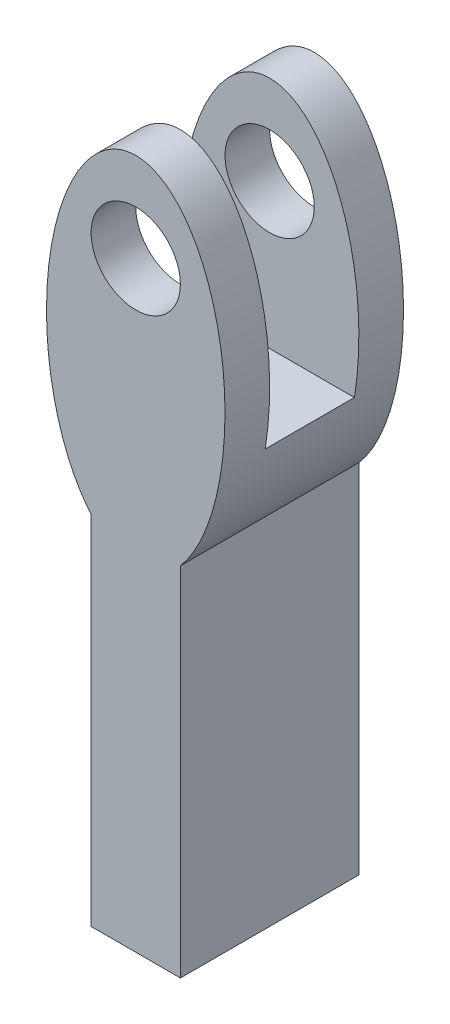
ISO-10303-21;
HEADER;
FILE_DESCRIPTION(('STEP AP214'),'2;1');
FILE_NAME('part.step','',(''),(''),'','','');
FILE_SCHEMA(('AUTOMOTIVE_DESIGN { 1 0 10303 214 1 1 1 1 }'));
ENDSEC;
DATA;
#1=APPLICATION_CONTEXT('core data for automotive mechanical design processes');
#2=APPLICATION_PROTOCOL_DEFINITION('international standard','automotive_design',2000,#1);
#3=PRODUCT_CONTEXT('',#1,'mechanical');
#4=PRODUCT('Part','Part','',(#3));
#5=PRODUCT_RELATED_PRODUCT_CATEGORY('part','',(#4));
#6=PRODUCT_DEFINITION_FORMATION('','',#4);
#7=PRODUCT_DEFINITION_CONTEXT('part definition',#1,'design');
#8=PRODUCT_DEFINITION('design','',#6,#7);
#9=PRODUCT_DEFINITION_SHAPE('','',#8);
#10=(LENGTH_UNIT() NAMED_UNIT(*) SI_UNIT(.MILLI.,.METRE.));
#11=(NAMED_UNIT(*) PLANE_ANGLE_UNIT() SI_UNIT($,.RADIAN.));
#12=(NAMED_UNIT(*) SI_UNIT($,.STERADIAN.) SOLID_ANGLE_UNIT());
#13=UNCERTAINTY_MEASURE_WITH_UNIT(LENGTH_MEASURE(1.E-05),#10,'distance_accuracy_value','');
#14=(GEOMETRIC_REPRESENTATION_CONTEXT(3) GLOBAL_UNCERTAINTY_ASSIGNED_CONTEXT((#13)) GLOBAL_UNIT_ASSIGNED_CONTEXT((#10,
#11,#12)) REPRESENTATION_CONTEXT('',''));
#15=CARTESIAN_POINT('',(0.,0.,0.));
#16=DIRECTION('',(0.,0.,1.));
#17=DIRECTION('',(1.,0.,0.));
#18=AXIS2_PLACEMENT_3D('',#15,#16,#17);
#19=CARTESIAN_POINT('',(0.,0.,-25.4));
#20=DIRECTION('',(0.,0.,1.));
#21=DIRECTION('',(0.,-1.,0.));
#22=AXIS2_PLACEMENT_3D('',#19,#20,#21);
#23=ELLIPSE('',#22,50.8,25.4);
#24=DIRECTION('',(0.,0.,1.));
#25=VECTOR('',#24,1.);
#26=SURFACE_OF_LINEAR_EXTRUSION('',#23,#25);
#27=DIRECTION('',(0.,0.,1.));
#28=VECTOR('',#27,1.);
#29=CARTESIAN_POINT('',(-12.7,-43.9940905122495,-25.4));
#30=LINE('',#29,#28);
#31=CARTESIAN_POINT('',(-12.7,-43.9940905122495,-25.4));
#32=VERTEX_POINT('',#31);
#33=CARTESIAN_POINT('',(-12.7,-43.9940905122495,25.4));
#34=VERTEX_POINT('',#33);
#35=EDGE_CURVE('E136',#32,#34,#30,.T.);
#36=ORIENTED_EDGE('',*,*,#35,.T.);
#37=CARTESIAN_POINT('',(0.,0.,25.4));
#38=DIRECTION('',(0.,0.,1.));
#39=DIRECTION('',(0.,-1.,0.));
#40=AXIS2_PLACEMENT_3D('',#37,#38,#39);
#41=ELLIPSE('',#40,50.8,25.4);
#42=CARTESIAN_POINT('',(12.7,-43.9940905122495,25.4));
#43=VERTEX_POINT('',#42);
#44=EDGE_CURVE('E114',#43,#34,#41,.T.);
#45=ORIENTED_EDGE('',*,*,#44,.F.);
#46=DIRECTION('',(0.,0.,1.));
#47=VECTOR('',#46,1.);
#48=CARTESIAN_POINT('',(12.7,-43.9940905122495,-25.4));
#49=LINE('',#48,#47);
#50=CARTESIAN_POINT('',(12.7,-43.9940905122495,-25.4));
#51=VERTEX_POINT('',#50);
#52=EDGE_CURVE('E11',#51,#43,#49,.T.);
#53=ORIENTED_EDGE('',*,*,#52,.F.);
#54=EDGE_CURVE('E125',#51,#32,#23,.T.);
#55=ORIENTED_EDGE('',*,*,#54,.T.);
#56=EDGE_LOOP('',(#36,#45,#53,#55));
#57=FACE_BOUND('',#56,.T.);
#58=DIRECTION('',(0.,0.,-1.));
#59=VECTOR('',#58,1.);
#60=CARTESIAN_POINT('',(24.13,-15.8622949159319,12.7));
#61=LINE('',#60,#59);
#62=CARTESIAN_POINT('',(24.13,-15.8622949159319,12.7));
#63=VERTEX_POINT('',#62);
#64=CARTESIAN_POINT('',(24.13,-15.8622949159319,-12.7));
#65=VERTEX_POINT('',#64);
#66=EDGE_CURVE('E97',#63,#65,#61,.T.);
#67=ORIENTED_EDGE('',*,*,#66,.F.);
#68=CARTESIAN_POINT('',(0.,0.,12.7));
#69=DIRECTION('',(0.,0.,1.));
#70=DIRECTION('',(0.,-1.,0.));
#71=AXIS2_PLACEMENT_3D('',#68,#69,#70);
#72=ELLIPSE('',#71,50.8,25.4);
#73=CARTESIAN_POINT('',(-24.13,-15.8622949159319,12.7));
#74=VERTEX_POINT('',#73);
#75=EDGE_CURVE('E98',#63,#74,#72,.T.);
#76=ORIENTED_EDGE('',*,*,#75,.T.);
#77=DIRECTION('',(0.,0.,-1.));
#78=VECTOR('',#77,1.);
#79=CARTESIAN_POINT('',(-24.13,-15.8622949159319,12.7));
#80=LINE('',#79,#78);
#81=CARTESIAN_POINT('',(-24.13,-15.8622949159319,-12.7));
#82=VERTEX_POINT('',#81);
#83=EDGE_CURVE('E95',#74,#82,#80,.T.);
#84=ORIENTED_EDGE('',*,*,#83,.T.);
#85=CARTESIAN_POINT('',(0.,0.,-12.7));
#86=DIRECTION('',(0.,0.,1.));
#87=DIRECTION('',(0.,-1.,0.));
#88=AXIS2_PLACEMENT_3D('',#85,#86,#87);
#89=ELLIPSE('',#88,50.8,25.4);
#90=EDGE_CURVE('E85',#65,#82,#89,.T.);
#91=ORIENTED_EDGE('',*,*,#90,.F.);
#92=EDGE_LOOP('',(#67,#76,#84,#91));
#93=FACE_BOUND('',#92,.T.);
#94=ADVANCED_FACE('F33',(#57,#93),#26,.T.);
#95=CARTESIAN_POINT('',(0.,25.4,-25.401));
#96=DIRECTION('',(0.,0.,1.));
#97=DIRECTION('',(1.,0.,0.));
#98=AXIS2_PLACEMENT_3D('',#95,#96,#97);
#99=CYLINDRICAL_SURFACE('',#98,12.7);
#100=CARTESIAN_POINT('',(0.,25.4,-25.4));
#101=DIRECTION('',(0.,0.,1.));
#102=DIRECTION('',(1.,0.,0.));
#103=AXIS2_PLACEMENT_3D('',#100,#101,#102);
#104=CIRCLE('',#103,12.7);
#105=CARTESIAN_POINT('',(12.7,25.4,-25.4));
#106=VERTEX_POINT('',#105);
#107=EDGE_CURVE('E111',#106,#106,#104,.F.);
#108=ORIENTED_EDGE('',*,*,#107,.T.);
#109=EDGE_LOOP('',(#108));
#110=FACE_BOUND('',#109,.T.);
#111=CARTESIAN_POINT('',(0.,25.4,-12.7));
#112=DIRECTION('',(0.,0.,1.));
#113=DIRECTION('',(1.,0.,0.));
#114=AXIS2_PLACEMENT_3D('',#111,#112,#113);
#115=CIRCLE('',#114,12.7);
#116=CARTESIAN_POINT('',(12.7,25.4,-12.7));
#117=VERTEX_POINT('',#116);
#118=EDGE_CURVE('E101',#117,#117,#115,.F.);
#119=ORIENTED_EDGE('',*,*,#118,.F.);
#120=EDGE_LOOP('',(#119));
#121=FACE_BOUND('',#120,.T.);
#122=ADVANCED_FACE('F163',(#110,#121),#99,.F.);
#123=CARTESIAN_POINT('',(12.7,-43.9940905122495,-25.4));
#124=DIRECTION('',(1.,0.,0.));
#125=DIRECTION('',(0.,1.,0.));
#126=AXIS2_PLACEMENT_3D('',#123,#124,#125);
#127=PLANE('',#126);
#128=ORIENTED_EDGE('',*,*,#52,.T.);
#129=DIRECTION('',(0.,1.,0.));
#130=VECTOR('',#129,1.);
#131=CARTESIAN_POINT('',(12.7,-43.9940905122495,25.4));
#132=LINE('',#131,#130);
#133=CARTESIAN_POINT('',(12.7,-145.594090512249,25.4));
#134=VERTEX_POINT('',#133);
#135=EDGE_CURVE('E123',#134,#43,#132,.T.);
#136=ORIENTED_EDGE('',*,*,#135,.F.);
#137=DIRECTION('',(0.,0.,1.));
#138=VECTOR('',#137,1.);
#139=CARTESIAN_POINT('',(12.7,-145.594090512249,-25.4));
#140=LINE('',#139,#138);
#141=CARTESIAN_POINT('',(12.7,-145.594090512249,-25.4));
#142=VERTEX_POINT('',#141);
#143=EDGE_CURVE('E42',#142,#134,#140,.T.);
#144=ORIENTED_EDGE('',*,*,#143,.F.);
#145=DIRECTION('',(0.,1.,0.));
#146=VECTOR('',#145,1.);
#147=CARTESIAN_POINT('',(12.7,-43.9940905122495,-25.4));
#148=LINE('',#147,#146);
#149=EDGE_CURVE('E134',#142,#51,#148,.T.);
#150=ORIENTED_EDGE('',*,*,#149,.T.);
#151=EDGE_LOOP('',(#128,#136,#144,#150));
#152=FACE_BOUND('',#151,.T.);
#153=ADVANCED_FACE('F150',(#152),#127,.T.);
#154=CARTESIAN_POINT('',(-12.7,-145.594090512249,-25.4));
#155=DIRECTION('',(0.,-1.,0.));
#156=DIRECTION('',(0.,0.,-1.));
#157=AXIS2_PLACEMENT_3D('',#154,#155,#156);
#158=PLANE('',#157);
#159=ORIENTED_EDGE('',*,*,#143,.T.);
#160=DIRECTION('',(1.,0.,0.));
#161=VECTOR('',#160,1.);
#162=CARTESIAN_POINT('',(-12.7,-145.594090512249,25.4));
#163=LINE('',#162,#161);
#164=CARTESIAN_POINT('',(-12.7,-145.594090512249,25.4));
#165=VERTEX_POINT('',#164);
#166=EDGE_CURVE('E120',#165,#134,#163,.T.);
#167=ORIENTED_EDGE('',*,*,#166,.F.);
#168=DIRECTION('',(0.,0.,1.));
#169=VECTOR('',#168,1.);
#170=CARTESIAN_POINT('',(-12.7,-145.594090512249,-25.4));
#171=LINE('',#170,#169);
#172=CARTESIAN_POINT('',(-12.7,-145.594090512249,-25.4));
#173=VERTEX_POINT('',#172);
#174=EDGE_CURVE('E139',#173,#165,#171,.T.);
#175=ORIENTED_EDGE('',*,*,#174,.F.);
#176=DIRECTION('',(1.,0.,0.));
#177=VECTOR('',#176,1.);
#178=CARTESIAN_POINT('',(-12.7,-145.594090512249,-25.4));
#179=LINE('',#178,#177);
#180=EDGE_CURVE('E131',#173,#142,#179,.T.);
#181=ORIENTED_EDGE('',*,*,#180,.T.);
#182=EDGE_LOOP('',(#159,#167,#175,#181));
#183=FACE_BOUND('',#182,.T.);
#184=ADVANCED_FACE('F156',(#183),#158,.T.);
#185=CARTESIAN_POINT('',(-12.7,-43.9940905122495,-25.4));
#186=DIRECTION('',(-1.,0.,0.));
#187=DIRECTION('',(0.,-1.,0.));
#188=AXIS2_PLACEMENT_3D('',#185,#186,#187);
#189=PLANE('',#188);
#190=ORIENTED_EDGE('',*,*,#174,.T.);
#191=DIRECTION('',(0.,-1.,0.));
#192=VECTOR('',#191,1.);
#193=CARTESIAN_POINT('',(-12.7,-43.9940905122495,25.4));
#194=LINE('',#193,#192);
#195=EDGE_CURVE('E117',#34,#165,#194,.T.);
#196=ORIENTED_EDGE('',*,*,#195,.F.);
#197=ORIENTED_EDGE('',*,*,#35,.F.);
#198=DIRECTION('',(0.,-1.,0.));
#199=VECTOR('',#198,1.);
#200=CARTESIAN_POINT('',(-12.7,-43.9940905122495,-25.4));
#201=LINE('',#200,#199);
#202=EDGE_CURVE('E128',#32,#173,#201,.T.);
#203=ORIENTED_EDGE('',*,*,#202,.T.);
#204=EDGE_LOOP('',(#190,#196,#197,#203));
#205=FACE_BOUND('',#204,.T.);
#206=ADVANCED_FACE('F144',(#205),#189,.T.);
#207=CARTESIAN_POINT('',(0.,0.,-25.4));
#208=DIRECTION('',(0.,0.,1.));
#209=DIRECTION('',(1.,0.,0.));
#210=AXIS2_PLACEMENT_3D('',#207,#208,#209);
#211=PLANE('',#210);
#212=ORIENTED_EDGE('',*,*,#107,.F.);
#213=EDGE_LOOP('',(#212));
#214=FACE_BOUND('',#213,.T.);
#215=ORIENTED_EDGE('',*,*,#54,.F.);
#216=ORIENTED_EDGE('',*,*,#149,.F.);
#217=ORIENTED_EDGE('',*,*,#180,.F.);
#218=ORIENTED_EDGE('',*,*,#202,.F.);
#219=EDGE_LOOP('',(#215,#216,#217,#218));
#220=FACE_BOUND('',#219,.T.);
#221=ADVANCED_FACE('F154',(#214,#220),#211,.F.);
#222=CARTESIAN_POINT('',(0.,0.,25.4));
#223=DIRECTION('',(0.,0.,1.));
#224=DIRECTION('',(1.,0.,0.));
#225=AXIS2_PLACEMENT_3D('',#222,#223,#224);
#226=PLANE('',#225);
#227=CARTESIAN_POINT('',(0.,25.4,25.4));
#228=DIRECTION('',(0.,0.,1.));
#229=DIRECTION('',(1.,0.,0.));
#230=AXIS2_PLACEMENT_3D('',#227,#228,#229);
#231=CIRCLE('',#230,12.7);
#232=CARTESIAN_POINT('',(12.7,25.4,25.4));
#233=VERTEX_POINT('',#232);
#234=EDGE_CURVE('E108',#233,#233,#231,.T.);
#235=ORIENTED_EDGE('',*,*,#234,.F.);
#236=EDGE_LOOP('',(#235));
#237=FACE_BOUND('',#236,.T.);
#238=ORIENTED_EDGE('',*,*,#44,.T.);
#239=ORIENTED_EDGE('',*,*,#195,.T.);
#240=ORIENTED_EDGE('',*,*,#166,.T.);
#241=ORIENTED_EDGE('',*,*,#135,.T.);
#242=EDGE_LOOP('',(#238,#239,#240,#241));
#243=FACE_BOUND('',#242,.T.);
#244=ADVANCED_FACE('F147',(#237,#243),#226,.T.);
#245=CARTESIAN_POINT('',(0.,25.4,12.7));
#246=DIRECTION('',(0.,0.,1.));
#247=DIRECTION('',(1.,0.,0.));
#248=AXIS2_PLACEMENT_3D('',#245,#246,#247);
#249=CIRCLE('',#248,12.7);
#250=CARTESIAN_POINT('',(12.7,25.4,12.7));
#251=VERTEX_POINT('',#250);
#252=EDGE_CURVE('E37',#251,#251,#249,.F.);
#253=ORIENTED_EDGE('',*,*,#252,.T.);
#254=EDGE_LOOP('',(#253));
#255=FACE_BOUND('',#254,.T.);
#256=ORIENTED_EDGE('',*,*,#234,.T.);
#257=EDGE_LOOP('',(#256));
#258=FACE_BOUND('',#257,.T.);
#259=ADVANCED_FACE('F171',(#255,#258),#99,.F.);
#260=CARTESIAN_POINT('',(0.,0.,12.7));
#261=DIRECTION('',(0.,0.,1.));
#262=DIRECTION('',(1.,0.,0.));
#263=AXIS2_PLACEMENT_3D('',#260,#261,#262);
#264=PLANE('',#263);
#265=ORIENTED_EDGE('',*,*,#75,.F.);
#266=DIRECTION('',(1.,0.,0.));
#267=VECTOR('',#266,1.);
#268=CARTESIAN_POINT('',(-24.13,-15.8622949159319,12.7));
#269=LINE('',#268,#267);
#270=EDGE_CURVE('E104',#74,#63,#269,.T.);
#271=ORIENTED_EDGE('',*,*,#270,.F.);
#272=EDGE_LOOP('',(#265,#271));
#273=FACE_BOUND('',#272,.T.);
#274=ORIENTED_EDGE('',*,*,#252,.F.);
#275=EDGE_LOOP('',(#274));
#276=FACE_BOUND('',#275,.T.);
#277=ADVANCED_FACE('F178',(#273,#276),#264,.F.);
#278=CARTESIAN_POINT('',(0.,0.,-12.7));
#279=DIRECTION('',(0.,0.,1.));
#280=DIRECTION('',(1.,0.,0.));
#281=AXIS2_PLACEMENT_3D('',#278,#279,#280);
#282=PLANE('',#281);
#283=ORIENTED_EDGE('',*,*,#90,.T.);
#284=DIRECTION('',(1.,0.,0.));
#285=VECTOR('',#284,1.);
#286=CARTESIAN_POINT('',(-24.13,-15.8622949159319,-12.7));
#287=LINE('',#286,#285);
#288=EDGE_CURVE('E49',#82,#65,#287,.T.);
#289=ORIENTED_EDGE('',*,*,#288,.T.);
#290=EDGE_LOOP('',(#283,#289));
#291=FACE_BOUND('',#290,.T.);
#292=ORIENTED_EDGE('',*,*,#118,.T.);
#293=EDGE_LOOP('',(#292));
#294=FACE_BOUND('',#293,.T.);
#295=ADVANCED_FACE('F86',(#291,#294),#282,.T.);
#296=CARTESIAN_POINT('',(-24.13,-15.8622949159319,12.7));
#297=DIRECTION('',(0.,1.,0.));
#298=DIRECTION('',(0.,0.,1.));
#299=AXIS2_PLACEMENT_3D('',#296,#297,#298);
#300=PLANE('',#299);
#301=ORIENTED_EDGE('',*,*,#83,.F.);
#302=ORIENTED_EDGE('',*,*,#270,.T.);
#303=ORIENTED_EDGE('',*,*,#66,.T.);
#304=ORIENTED_EDGE('',*,*,#288,.F.);
#305=EDGE_LOOP('',(#301,#302,#303,#304));
#306=FACE_BOUND('',#305,.T.);
#307=ADVANCED_FACE('F94',(#306),#300,.T.);
#308=CLOSED_SHELL('',(#94,#122,#153,#184,#206,#221,#244,#259,#277,#295,#307));
#309=MANIFOLD_SOLID_BREP('B2',#308);
#310=ADVANCED_BREP_SHAPE_REPRESENTATION('',(#18,#309),#14);
#311=SHAPE_DEFINITION_REPRESENTATION(#9,#310);
ENDSEC;
END-ISO-10303-21;
